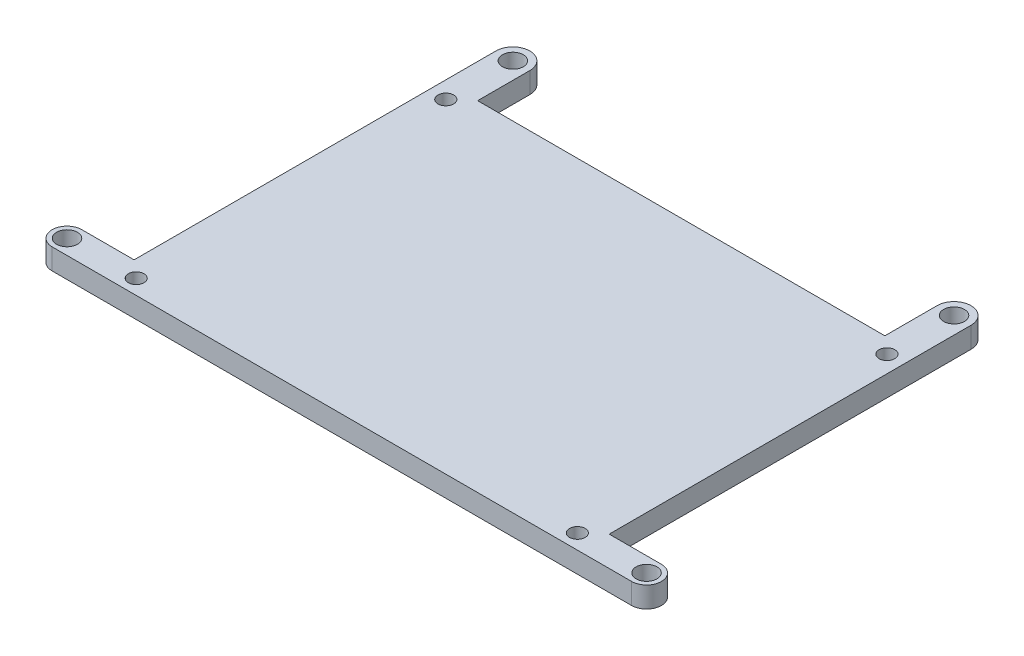
ISO-10303-21;
HEADER;
FILE_DESCRIPTION(('STEP AP214'),'2;1');
FILE_NAME('part.step','',(''),(''),'','','');
FILE_SCHEMA(('AUTOMOTIVE_DESIGN { 1 0 10303 214 1 1 1 1 }'));
ENDSEC;
DATA;
#1=APPLICATION_CONTEXT('core data for automotive mechanical design processes');
#2=APPLICATION_PROTOCOL_DEFINITION('international standard','automotive_design',2000,#1);
#3=PRODUCT_CONTEXT('',#1,'mechanical');
#4=PRODUCT('Part','Part','',(#3));
#5=PRODUCT_RELATED_PRODUCT_CATEGORY('part','',(#4));
#6=PRODUCT_DEFINITION_FORMATION('','',#4);
#7=PRODUCT_DEFINITION_CONTEXT('part definition',#1,'design');
#8=PRODUCT_DEFINITION('design','',#6,#7);
#9=PRODUCT_DEFINITION_SHAPE('','',#8);
#10=(LENGTH_UNIT() NAMED_UNIT(*) SI_UNIT(.MILLI.,.METRE.));
#11=(NAMED_UNIT(*) PLANE_ANGLE_UNIT() SI_UNIT($,.RADIAN.));
#12=(NAMED_UNIT(*) SI_UNIT($,.STERADIAN.) SOLID_ANGLE_UNIT());
#13=UNCERTAINTY_MEASURE_WITH_UNIT(LENGTH_MEASURE(1.E-05),#10,'distance_accuracy_value','');
#14=(GEOMETRIC_REPRESENTATION_CONTEXT(3) GLOBAL_UNCERTAINTY_ASSIGNED_CONTEXT((#13)) GLOBAL_UNIT_ASSIGNED_CONTEXT((#10,
#11,#12)) REPRESENTATION_CONTEXT('',''));
#15=CARTESIAN_POINT('',(0.,0.,0.));
#16=DIRECTION('',(0.,0.,1.));
#17=DIRECTION('',(1.,0.,0.));
#18=AXIS2_PLACEMENT_3D('',#15,#16,#17);
#19=CARTESIAN_POINT('',(0.,2.,32.5));
#20=DIRECTION('',(0.,0.,-1.));
#21=DIRECTION('',(-1.,0.,0.));
#22=AXIS2_PLACEMENT_3D('',#19,#20,#21);
#23=PLANE('',#22);
#24=DIRECTION('',(1.,0.,0.));
#25=VECTOR('',#24,1.);
#26=CARTESIAN_POINT('',(0.,-2.,32.5));
#27=LINE('',#26,#25);
#28=CARTESIAN_POINT('',(-55.5,-2.,32.5));
#29=VERTEX_POINT('',#28);
#30=CARTESIAN_POINT('',(55.5,-2.,32.5));
#31=VERTEX_POINT('',#30);
#32=EDGE_CURVE('E181',#29,#31,#27,.T.);
#33=ORIENTED_EDGE('',*,*,#32,.T.);
#34=DIRECTION('',(0.,-1.,0.));
#35=VECTOR('',#34,1.);
#36=CARTESIAN_POINT('',(55.5,2.,32.5));
#37=LINE('',#36,#35);
#38=CARTESIAN_POINT('',(55.5,2.,32.5));
#39=VERTEX_POINT('',#38);
#40=EDGE_CURVE('E11',#39,#31,#37,.T.);
#41=ORIENTED_EDGE('',*,*,#40,.F.);
#42=DIRECTION('',(1.,0.,0.));
#43=VECTOR('',#42,1.);
#44=CARTESIAN_POINT('',(0.,2.,32.5));
#45=LINE('',#44,#43);
#46=CARTESIAN_POINT('',(-55.5,2.,32.5));
#47=VERTEX_POINT('',#46);
#48=EDGE_CURVE('E538',#47,#39,#45,.T.);
#49=ORIENTED_EDGE('',*,*,#48,.F.);
#50=DIRECTION('',(0.,-1.,0.));
#51=VECTOR('',#50,1.);
#52=CARTESIAN_POINT('',(-55.5,2.,32.5));
#53=LINE('',#52,#51);
#54=EDGE_CURVE('E52',#47,#29,#53,.T.);
#55=ORIENTED_EDGE('',*,*,#54,.T.);
#56=EDGE_LOOP('',(#33,#41,#49,#55));
#57=FACE_BOUND('',#56,.T.);
#58=ADVANCED_FACE('F35',(#57),#23,.F.);
#59=CARTESIAN_POINT('',(55.5,2.,29.65));
#60=DIRECTION('',(0.,-1.,0.));
#61=DIRECTION('',(0.,0.,-1.));
#62=AXIS2_PLACEMENT_3D('',#59,#60,#61);
#63=CYLINDRICAL_SURFACE('',#62,2.84999999999999);
#64=CARTESIAN_POINT('',(55.5,-2.,29.65));
#65=DIRECTION('',(0.,1.,0.));
#66=DIRECTION('',(0.,0.,1.));
#67=AXIS2_PLACEMENT_3D('',#64,#65,#66);
#68=CIRCLE('',#67,2.84999999999999);
#69=CARTESIAN_POINT('',(55.5,-2.,26.8));
#70=VERTEX_POINT('',#69);
#71=EDGE_CURVE('E183',#31,#70,#68,.T.);
#72=ORIENTED_EDGE('',*,*,#71,.T.);
#73=DIRECTION('',(0.,-1.,0.));
#74=VECTOR('',#73,1.);
#75=CARTESIAN_POINT('',(55.5,2.,26.8));
#76=LINE('',#75,#74);
#77=CARTESIAN_POINT('',(55.5,2.,26.8));
#78=VERTEX_POINT('',#77);
#79=EDGE_CURVE('E44',#78,#70,#76,.T.);
#80=ORIENTED_EDGE('',*,*,#79,.F.);
#81=CARTESIAN_POINT('',(55.5,2.,29.65));
#82=DIRECTION('',(0.,1.,0.));
#83=DIRECTION('',(0.,0.,1.));
#84=AXIS2_PLACEMENT_3D('',#81,#82,#83);
#85=CIRCLE('',#84,2.84999999999999);
#86=EDGE_CURVE('E102',#39,#78,#85,.T.);
#87=ORIENTED_EDGE('',*,*,#86,.F.);
#88=ORIENTED_EDGE('',*,*,#40,.T.);
#89=EDGE_LOOP('',(#72,#80,#87,#88));
#90=FACE_BOUND('',#89,.T.);
#91=ADVANCED_FACE('F276',(#90),#63,.T.);
#92=CARTESIAN_POINT('',(1.48769885299773E-13,2.,26.8000000000003));
#93=DIRECTION('',(0.,0.,1.));
#94=DIRECTION('',(1.,0.,0.));
#95=AXIS2_PLACEMENT_3D('',#92,#93,#94);
#96=PLANE('',#95);
#97=DIRECTION('',(-1.,0.,0.));
#98=VECTOR('',#97,1.);
#99=CARTESIAN_POINT('',(1.48769885299773E-13,-2.,26.8000000000003));
#100=LINE('',#99,#98);
#101=CARTESIAN_POINT('',(45.5,-2.,26.8000000000001));
#102=VERTEX_POINT('',#101);
#103=EDGE_CURVE('E185',#70,#102,#100,.T.);
#104=ORIENTED_EDGE('',*,*,#103,.T.);
#105=DIRECTION('',(0.,-1.,0.));
#106=VECTOR('',#105,1.);
#107=CARTESIAN_POINT('',(45.5,2.,26.8000000000001));
#108=LINE('',#107,#106);
#109=CARTESIAN_POINT('',(45.5,2.,26.8000000000001));
#110=VERTEX_POINT('',#109);
#111=EDGE_CURVE('E226',#110,#102,#108,.T.);
#112=ORIENTED_EDGE('',*,*,#111,.F.);
#113=DIRECTION('',(-1.,0.,0.));
#114=VECTOR('',#113,1.);
#115=CARTESIAN_POINT('',(1.48769885299773E-13,2.,26.8000000000003));
#116=LINE('',#115,#114);
#117=EDGE_CURVE('E233',#78,#110,#116,.T.);
#118=ORIENTED_EDGE('',*,*,#117,.F.);
#119=ORIENTED_EDGE('',*,*,#79,.T.);
#120=EDGE_LOOP('',(#104,#112,#118,#119));
#121=FACE_BOUND('',#120,.T.);
#122=ADVANCED_FACE('F231',(#121),#96,.F.);
#123=CARTESIAN_POINT('',(45.5,2.,0.));
#124=DIRECTION('',(1.,0.,0.));
#125=DIRECTION('',(0.,0.,-1.));
#126=AXIS2_PLACEMENT_3D('',#123,#124,#125);
#127=PLANE('',#126);
#128=DIRECTION('',(0.,0.,1.));
#129=VECTOR('',#128,1.);
#130=CARTESIAN_POINT('',(45.5,-2.,0.));
#131=LINE('',#130,#129);
#132=CARTESIAN_POINT('',(45.5,-2.,-42.5));
#133=VERTEX_POINT('',#132);
#134=EDGE_CURVE('E188',#133,#102,#131,.T.);
#135=ORIENTED_EDGE('',*,*,#134,.F.);
#136=DIRECTION('',(0.,-1.,0.));
#137=VECTOR('',#136,1.);
#138=CARTESIAN_POINT('',(45.5,2.,-42.5));
#139=LINE('',#138,#137);
#140=CARTESIAN_POINT('',(45.5,2.,-42.5));
#141=VERTEX_POINT('',#140);
#142=EDGE_CURVE('E224',#141,#133,#139,.T.);
#143=ORIENTED_EDGE('',*,*,#142,.F.);
#144=DIRECTION('',(0.,0.,1.));
#145=VECTOR('',#144,1.);
#146=CARTESIAN_POINT('',(45.5,2.,0.));
#147=LINE('',#146,#145);
#148=EDGE_CURVE('E244',#141,#110,#147,.T.);
#149=ORIENTED_EDGE('',*,*,#148,.T.);
#150=ORIENTED_EDGE('',*,*,#111,.T.);
#151=EDGE_LOOP('',(#135,#143,#149,#150));
#152=FACE_BOUND('',#151,.T.);
#153=ADVANCED_FACE('F240',(#152),#127,.T.);
#154=CARTESIAN_POINT('',(42.25,2.,-42.5));
#155=DIRECTION('',(0.,-1.,0.));
#156=DIRECTION('',(0.,0.,-1.));
#157=AXIS2_PLACEMENT_3D('',#154,#155,#156);
#158=CYLINDRICAL_SURFACE('',#157,3.25);
#159=CARTESIAN_POINT('',(42.25,-2.,-42.5));
#160=DIRECTION('',(0.,1.,0.));
#161=DIRECTION('',(0.,0.,1.));
#162=AXIS2_PLACEMENT_3D('',#159,#160,#161);
#163=CIRCLE('',#162,3.25);
#164=CARTESIAN_POINT('',(39.,-2.,-42.5));
#165=VERTEX_POINT('',#164);
#166=EDGE_CURVE('E191',#133,#165,#163,.T.);
#167=ORIENTED_EDGE('',*,*,#166,.T.);
#168=DIRECTION('',(0.,-1.,0.));
#169=VECTOR('',#168,1.);
#170=CARTESIAN_POINT('',(39.,2.,-42.5));
#171=LINE('',#170,#169);
#172=CARTESIAN_POINT('',(39.,2.,-42.5));
#173=VERTEX_POINT('',#172);
#174=EDGE_CURVE('E221',#173,#165,#171,.T.);
#175=ORIENTED_EDGE('',*,*,#174,.F.);
#176=CARTESIAN_POINT('',(42.25,2.,-42.5));
#177=DIRECTION('',(0.,1.,0.));
#178=DIRECTION('',(0.,0.,1.));
#179=AXIS2_PLACEMENT_3D('',#176,#177,#178);
#180=CIRCLE('',#179,3.25);
#181=EDGE_CURVE('E245',#141,#173,#180,.T.);
#182=ORIENTED_EDGE('',*,*,#181,.F.);
#183=ORIENTED_EDGE('',*,*,#142,.T.);
#184=EDGE_LOOP('',(#167,#175,#182,#183));
#185=FACE_BOUND('',#184,.T.);
#186=ADVANCED_FACE('F451',(#185),#158,.T.);
#187=CARTESIAN_POINT('',(39.,2.,0.));
#188=DIRECTION('',(1.,0.,0.));
#189=DIRECTION('',(0.,0.,-1.));
#190=AXIS2_PLACEMENT_3D('',#187,#188,#189);
#191=PLANE('',#190);
#192=DIRECTION('',(0.,0.,1.));
#193=VECTOR('',#192,1.);
#194=CARTESIAN_POINT('',(39.,-2.,0.));
#195=LINE('',#194,#193);
#196=CARTESIAN_POINT('',(39.,-2.,-32.5));
#197=VERTEX_POINT('',#196);
#198=EDGE_CURVE('E193',#165,#197,#195,.T.);
#199=ORIENTED_EDGE('',*,*,#198,.T.);
#200=DIRECTION('',(0.,-1.,0.));
#201=VECTOR('',#200,1.);
#202=CARTESIAN_POINT('',(39.,2.,-32.5));
#203=LINE('',#202,#201);
#204=CARTESIAN_POINT('',(39.,2.,-32.5));
#205=VERTEX_POINT('',#204);
#206=EDGE_CURVE('E219',#205,#197,#203,.T.);
#207=ORIENTED_EDGE('',*,*,#206,.F.);
#208=DIRECTION('',(0.,0.,1.));
#209=VECTOR('',#208,1.);
#210=CARTESIAN_POINT('',(39.,2.,0.));
#211=LINE('',#210,#209);
#212=EDGE_CURVE('E247',#173,#205,#211,.T.);
#213=ORIENTED_EDGE('',*,*,#212,.F.);
#214=ORIENTED_EDGE('',*,*,#174,.T.);
#215=EDGE_LOOP('',(#199,#207,#213,#214));
#216=FACE_BOUND('',#215,.T.);
#217=ADVANCED_FACE('F441',(#216),#191,.F.);
#218=CARTESIAN_POINT('',(0.,2.,-32.5));
#219=DIRECTION('',(0.,0.,-1.));
#220=DIRECTION('',(-1.,0.,0.));
#221=AXIS2_PLACEMENT_3D('',#218,#219,#220);
#222=PLANE('',#221);
#223=DIRECTION('',(1.,0.,0.));
#224=VECTOR('',#223,1.);
#225=CARTESIAN_POINT('',(0.,-2.,-32.5));
#226=LINE('',#225,#224);
#227=CARTESIAN_POINT('',(-39.,-2.,-32.5));
#228=VERTEX_POINT('',#227);
#229=EDGE_CURVE('E196',#228,#197,#226,.T.);
#230=ORIENTED_EDGE('',*,*,#229,.F.);
#231=DIRECTION('',(0.,-1.,0.));
#232=VECTOR('',#231,1.);
#233=CARTESIAN_POINT('',(-39.,2.,-32.5));
#234=LINE('',#233,#232);
#235=CARTESIAN_POINT('',(-39.,2.,-32.5));
#236=VERTEX_POINT('',#235);
#237=EDGE_CURVE('E217',#236,#228,#234,.T.);
#238=ORIENTED_EDGE('',*,*,#237,.F.);
#239=DIRECTION('',(1.,0.,0.));
#240=VECTOR('',#239,1.);
#241=CARTESIAN_POINT('',(0.,2.,-32.5));
#242=LINE('',#241,#240);
#243=EDGE_CURVE('E253',#236,#205,#242,.T.);
#244=ORIENTED_EDGE('',*,*,#243,.T.);
#245=ORIENTED_EDGE('',*,*,#206,.T.);
#246=EDGE_LOOP('',(#230,#238,#244,#245));
#247=FACE_BOUND('',#246,.T.);
#248=ADVANCED_FACE('F431',(#247),#222,.T.);
#249=CARTESIAN_POINT('',(-39.,2.,0.));
#250=DIRECTION('',(1.,0.,0.));
#251=DIRECTION('',(0.,0.,-1.));
#252=AXIS2_PLACEMENT_3D('',#249,#250,#251);
#253=PLANE('',#252);
#254=DIRECTION('',(0.,0.,1.));
#255=VECTOR('',#254,1.);
#256=CARTESIAN_POINT('',(-39.,-2.,0.));
#257=LINE('',#256,#255);
#258=CARTESIAN_POINT('',(-39.,-2.,-42.5));
#259=VERTEX_POINT('',#258);
#260=EDGE_CURVE('E199',#259,#228,#257,.T.);
#261=ORIENTED_EDGE('',*,*,#260,.F.);
#262=DIRECTION('',(0.,-1.,0.));
#263=VECTOR('',#262,1.);
#264=CARTESIAN_POINT('',(-39.,2.,-42.5));
#265=LINE('',#264,#263);
#266=CARTESIAN_POINT('',(-39.,2.,-42.5));
#267=VERTEX_POINT('',#266);
#268=EDGE_CURVE('E215',#267,#259,#265,.T.);
#269=ORIENTED_EDGE('',*,*,#268,.F.);
#270=DIRECTION('',(0.,0.,1.));
#271=VECTOR('',#270,1.);
#272=CARTESIAN_POINT('',(-39.,2.,0.));
#273=LINE('',#272,#271);
#274=EDGE_CURVE('E256',#267,#236,#273,.T.);
#275=ORIENTED_EDGE('',*,*,#274,.T.);
#276=ORIENTED_EDGE('',*,*,#237,.T.);
#277=EDGE_LOOP('',(#261,#269,#275,#276));
#278=FACE_BOUND('',#277,.T.);
#279=ADVANCED_FACE('F422',(#278),#253,.T.);
#280=CARTESIAN_POINT('',(-42.25,2.,-42.5));
#281=DIRECTION('',(0.,-1.,0.));
#282=DIRECTION('',(0.,0.,-1.));
#283=AXIS2_PLACEMENT_3D('',#280,#281,#282);
#284=CYLINDRICAL_SURFACE('',#283,3.25);
#285=CARTESIAN_POINT('',(-42.25,-2.,-42.5));
#286=DIRECTION('',(0.,1.,0.));
#287=DIRECTION('',(0.,0.,1.));
#288=AXIS2_PLACEMENT_3D('',#285,#286,#287);
#289=CIRCLE('',#288,3.25);
#290=CARTESIAN_POINT('',(-45.5,-2.,-42.5));
#291=VERTEX_POINT('',#290);
#292=EDGE_CURVE('E202',#291,#259,#289,.F.);
#293=ORIENTED_EDGE('',*,*,#292,.F.);
#294=DIRECTION('',(0.,-1.,0.));
#295=VECTOR('',#294,1.);
#296=CARTESIAN_POINT('',(-45.5,2.,-42.5));
#297=LINE('',#296,#295);
#298=CARTESIAN_POINT('',(-45.5,2.,-42.5));
#299=VERTEX_POINT('',#298);
#300=EDGE_CURVE('E139',#299,#291,#297,.T.);
#301=ORIENTED_EDGE('',*,*,#300,.F.);
#302=CARTESIAN_POINT('',(-42.25,2.,-42.5));
#303=DIRECTION('',(0.,1.,0.));
#304=DIRECTION('',(0.,0.,1.));
#305=AXIS2_PLACEMENT_3D('',#302,#303,#304);
#306=CIRCLE('',#305,3.25);
#307=EDGE_CURVE('E149',#299,#267,#306,.F.);
#308=ORIENTED_EDGE('',*,*,#307,.T.);
#309=ORIENTED_EDGE('',*,*,#268,.T.);
#310=EDGE_LOOP('',(#293,#301,#308,#309));
#311=FACE_BOUND('',#310,.T.);
#312=ADVANCED_FACE('F260',(#311),#284,.T.);
#313=CARTESIAN_POINT('',(-45.5,2.,0.));
#314=DIRECTION('',(-1.,0.,0.));
#315=DIRECTION('',(0.,0.,1.));
#316=AXIS2_PLACEMENT_3D('',#313,#314,#315);
#317=PLANE('',#316);
#318=DIRECTION('',(0.,0.,-1.));
#319=VECTOR('',#318,1.);
#320=CARTESIAN_POINT('',(-45.5,-2.,0.));
#321=LINE('',#320,#319);
#322=CARTESIAN_POINT('',(-45.5,-2.,26.8000000000001));
#323=VERTEX_POINT('',#322);
#324=EDGE_CURVE('E135',#323,#291,#321,.T.);
#325=ORIENTED_EDGE('',*,*,#324,.F.);
#326=DIRECTION('',(0.,-1.,0.));
#327=VECTOR('',#326,1.);
#328=CARTESIAN_POINT('',(-45.5,2.,26.8000000000001));
#329=LINE('',#328,#327);
#330=CARTESIAN_POINT('',(-45.5,2.,26.8000000000001));
#331=VERTEX_POINT('',#330);
#332=EDGE_CURVE('E130',#331,#323,#329,.T.);
#333=ORIENTED_EDGE('',*,*,#332,.F.);
#334=DIRECTION('',(0.,0.,-1.));
#335=VECTOR('',#334,1.);
#336=CARTESIAN_POINT('',(-45.5,2.,0.));
#337=LINE('',#336,#335);
#338=EDGE_CURVE('E133',#331,#299,#337,.T.);
#339=ORIENTED_EDGE('',*,*,#338,.T.);
#340=ORIENTED_EDGE('',*,*,#300,.T.);
#341=EDGE_LOOP('',(#325,#333,#339,#340));
#342=FACE_BOUND('',#341,.T.);
#343=ADVANCED_FACE('F132',(#342),#317,.T.);
#344=CARTESIAN_POINT('',(-1.48769885299773E-13,2.,26.8000000000003));
#345=DIRECTION('',(0.,0.,-1.));
#346=DIRECTION('',(-1.,0.,0.));
#347=AXIS2_PLACEMENT_3D('',#344,#345,#346);
#348=PLANE('',#347);
#349=DIRECTION('',(1.,0.,0.));
#350=VECTOR('',#349,1.);
#351=CARTESIAN_POINT('',(-1.48769885299773E-13,-2.,26.8000000000003));
#352=LINE('',#351,#350);
#353=CARTESIAN_POINT('',(-55.5,-2.,26.8));
#354=VERTEX_POINT('',#353);
#355=EDGE_CURVE('E206',#354,#323,#352,.T.);
#356=ORIENTED_EDGE('',*,*,#355,.F.);
#357=DIRECTION('',(0.,-1.,0.));
#358=VECTOR('',#357,1.);
#359=CARTESIAN_POINT('',(-55.5,2.,26.8));
#360=LINE('',#359,#358);
#361=CARTESIAN_POINT('',(-55.5,2.,26.8));
#362=VERTEX_POINT('',#361);
#363=EDGE_CURVE('E90',#362,#354,#360,.T.);
#364=ORIENTED_EDGE('',*,*,#363,.F.);
#365=DIRECTION('',(1.,0.,0.));
#366=VECTOR('',#365,1.);
#367=CARTESIAN_POINT('',(-1.48769885299773E-13,2.,26.8000000000003));
#368=LINE('',#367,#366);
#369=EDGE_CURVE('E146',#362,#331,#368,.T.);
#370=ORIENTED_EDGE('',*,*,#369,.T.);
#371=ORIENTED_EDGE('',*,*,#332,.T.);
#372=EDGE_LOOP('',(#356,#364,#370,#371));
#373=FACE_BOUND('',#372,.T.);
#374=ADVANCED_FACE('F151',(#373),#348,.T.);
#375=CARTESIAN_POINT('',(42.25,2.,-42.5));
#376=DIRECTION('',(0.,-1.,0.));
#377=DIRECTION('',(0.,0.,-1.));
#378=AXIS2_PLACEMENT_3D('',#375,#376,#377);
#379=CYLINDRICAL_SURFACE('',#378,2.);
#380=CARTESIAN_POINT('',(42.25,2.,-42.5));
#381=DIRECTION('',(0.,1.,0.));
#382=DIRECTION('',(0.,0.,1.));
#383=AXIS2_PLACEMENT_3D('',#380,#381,#382);
#384=CIRCLE('',#383,2.);
#385=CARTESIAN_POINT('',(42.25,2.,-40.5));
#386=VERTEX_POINT('',#385);
#387=EDGE_CURVE('E535',#386,#386,#384,.F.);
#388=ORIENTED_EDGE('',*,*,#387,.F.);
#389=EDGE_LOOP('',(#388));
#390=FACE_BOUND('',#389,.T.);
#391=CARTESIAN_POINT('',(42.25,-2.,-42.5));
#392=DIRECTION('',(0.,1.,0.));
#393=DIRECTION('',(0.,0.,1.));
#394=AXIS2_PLACEMENT_3D('',#391,#392,#393);
#395=CIRCLE('',#394,2.);
#396=CARTESIAN_POINT('',(42.25,-2.,-40.5));
#397=VERTEX_POINT('',#396);
#398=EDGE_CURVE('E178',#397,#397,#395,.F.);
#399=ORIENTED_EDGE('',*,*,#398,.T.);
#400=EDGE_LOOP('',(#399));
#401=FACE_BOUND('',#400,.T.);
#402=ADVANCED_FACE('F284',(#390,#401),#379,.F.);
#403=CARTESIAN_POINT('',(-42.25,2.,-42.5));
#404=DIRECTION('',(0.,-1.,0.));
#405=DIRECTION('',(0.,0.,-1.));
#406=AXIS2_PLACEMENT_3D('',#403,#404,#405);
#407=CYLINDRICAL_SURFACE('',#406,2.);
#408=CARTESIAN_POINT('',(-42.25,2.,-42.5));
#409=DIRECTION('',(0.,1.,0.));
#410=DIRECTION('',(0.,0.,1.));
#411=AXIS2_PLACEMENT_3D('',#408,#409,#410);
#412=CIRCLE('',#411,2.);
#413=CARTESIAN_POINT('',(-42.25,2.,-40.5));
#414=VERTEX_POINT('',#413);
#415=EDGE_CURVE('E532',#414,#414,#412,.T.);
#416=ORIENTED_EDGE('',*,*,#415,.T.);
#417=EDGE_LOOP('',(#416));
#418=FACE_BOUND('',#417,.T.);
#419=CARTESIAN_POINT('',(-42.25,-2.,-42.5));
#420=DIRECTION('',(0.,1.,0.));
#421=DIRECTION('',(0.,0.,1.));
#422=AXIS2_PLACEMENT_3D('',#419,#420,#421);
#423=CIRCLE('',#422,2.);
#424=CARTESIAN_POINT('',(-42.25,-2.,-40.5));
#425=VERTEX_POINT('',#424);
#426=EDGE_CURVE('E175',#425,#425,#423,.T.);
#427=ORIENTED_EDGE('',*,*,#426,.F.);
#428=EDGE_LOOP('',(#427));
#429=FACE_BOUND('',#428,.T.);
#430=ADVANCED_FACE('F287',(#418,#429),#407,.F.);
#431=CARTESIAN_POINT('',(42.25,2.,-29.65));
#432=DIRECTION('',(0.,-1.,0.));
#433=DIRECTION('',(0.,0.,-1.));
#434=AXIS2_PLACEMENT_3D('',#431,#432,#433);
#435=CYLINDRICAL_SURFACE('',#434,1.5);
#436=CARTESIAN_POINT('',(42.25,2.,-29.65));
#437=DIRECTION('',(0.,1.,0.));
#438=DIRECTION('',(0.,0.,1.));
#439=AXIS2_PLACEMENT_3D('',#436,#437,#438);
#440=CIRCLE('',#439,1.5);
#441=CARTESIAN_POINT('',(42.25,2.,-28.15));
#442=VERTEX_POINT('',#441);
#443=EDGE_CURVE('E529',#442,#442,#440,.F.);
#444=ORIENTED_EDGE('',*,*,#443,.F.);
#445=EDGE_LOOP('',(#444));
#446=FACE_BOUND('',#445,.T.);
#447=CARTESIAN_POINT('',(42.25,-2.,-29.65));
#448=DIRECTION('',(0.,1.,0.));
#449=DIRECTION('',(0.,0.,1.));
#450=AXIS2_PLACEMENT_3D('',#447,#448,#449);
#451=CIRCLE('',#450,1.5);
#452=CARTESIAN_POINT('',(42.25,-2.,-28.15));
#453=VERTEX_POINT('',#452);
#454=EDGE_CURVE('E172',#453,#453,#451,.F.);
#455=ORIENTED_EDGE('',*,*,#454,.T.);
#456=EDGE_LOOP('',(#455));
#457=FACE_BOUND('',#456,.T.);
#458=ADVANCED_FACE('F291',(#446,#457),#435,.F.);
#459=CARTESIAN_POINT('',(-42.25,2.,-29.65));
#460=DIRECTION('',(0.,-1.,0.));
#461=DIRECTION('',(0.,0.,-1.));
#462=AXIS2_PLACEMENT_3D('',#459,#460,#461);
#463=CYLINDRICAL_SURFACE('',#462,1.5);
#464=CARTESIAN_POINT('',(-42.25,2.,-29.65));
#465=DIRECTION('',(0.,1.,0.));
#466=DIRECTION('',(0.,0.,1.));
#467=AXIS2_PLACEMENT_3D('',#464,#465,#466);
#468=CIRCLE('',#467,1.5);
#469=CARTESIAN_POINT('',(-42.25,2.,-28.15));
#470=VERTEX_POINT('',#469);
#471=EDGE_CURVE('E526',#470,#470,#468,.T.);
#472=ORIENTED_EDGE('',*,*,#471,.T.);
#473=EDGE_LOOP('',(#472));
#474=FACE_BOUND('',#473,.T.);
#475=CARTESIAN_POINT('',(-42.25,-2.,-29.65));
#476=DIRECTION('',(0.,1.,0.));
#477=DIRECTION('',(0.,0.,1.));
#478=AXIS2_PLACEMENT_3D('',#475,#476,#477);
#479=CIRCLE('',#478,1.5);
#480=CARTESIAN_POINT('',(-42.25,-2.,-28.15));
#481=VERTEX_POINT('',#480);
#482=EDGE_CURVE('E169',#481,#481,#479,.T.);
#483=ORIENTED_EDGE('',*,*,#482,.F.);
#484=EDGE_LOOP('',(#483));
#485=FACE_BOUND('',#484,.T.);
#486=ADVANCED_FACE('F295',(#474,#485),#463,.F.);
#487=CARTESIAN_POINT('',(42.25,2.,29.65));
#488=DIRECTION('',(0.,-1.,0.));
#489=DIRECTION('',(0.,0.,-1.));
#490=AXIS2_PLACEMENT_3D('',#487,#488,#489);
#491=CYLINDRICAL_SURFACE('',#490,1.5);
#492=CARTESIAN_POINT('',(42.25,2.,29.65));
#493=DIRECTION('',(0.,1.,0.));
#494=DIRECTION('',(0.,0.,1.));
#495=AXIS2_PLACEMENT_3D('',#492,#493,#494);
#496=CIRCLE('',#495,1.5);
#497=CARTESIAN_POINT('',(42.25,2.,31.15));
#498=VERTEX_POINT('',#497);
#499=EDGE_CURVE('E519',#498,#498,#496,.T.);
#500=ORIENTED_EDGE('',*,*,#499,.T.);
#501=EDGE_LOOP('',(#500));
#502=FACE_BOUND('',#501,.T.);
#503=CARTESIAN_POINT('',(42.25,-2.,29.65));
#504=DIRECTION('',(0.,1.,0.));
#505=DIRECTION('',(0.,0.,1.));
#506=AXIS2_PLACEMENT_3D('',#503,#504,#505);
#507=CIRCLE('',#506,1.5);
#508=CARTESIAN_POINT('',(42.25,-2.,31.15));
#509=VERTEX_POINT('',#508);
#510=EDGE_CURVE('E166',#509,#509,#507,.T.);
#511=ORIENTED_EDGE('',*,*,#510,.F.);
#512=EDGE_LOOP('',(#511));
#513=FACE_BOUND('',#512,.T.);
#514=ADVANCED_FACE('F299',(#502,#513),#491,.F.);
#515=CARTESIAN_POINT('',(-42.25,2.,29.65));
#516=DIRECTION('',(0.,-1.,0.));
#517=DIRECTION('',(0.,0.,-1.));
#518=AXIS2_PLACEMENT_3D('',#515,#516,#517);
#519=CYLINDRICAL_SURFACE('',#518,1.5);
#520=CARTESIAN_POINT('',(-42.25,2.,29.65));
#521=DIRECTION('',(0.,1.,0.));
#522=DIRECTION('',(0.,0.,1.));
#523=AXIS2_PLACEMENT_3D('',#520,#521,#522);
#524=CIRCLE('',#523,1.5);
#525=CARTESIAN_POINT('',(-42.25,2.,31.15));
#526=VERTEX_POINT('',#525);
#527=EDGE_CURVE('E516',#526,#526,#524,.F.);
#528=ORIENTED_EDGE('',*,*,#527,.F.);
#529=EDGE_LOOP('',(#528));
#530=FACE_BOUND('',#529,.T.);
#531=CARTESIAN_POINT('',(-42.25,-2.,29.65));
#532=DIRECTION('',(0.,1.,0.));
#533=DIRECTION('',(0.,0.,1.));
#534=AXIS2_PLACEMENT_3D('',#531,#532,#533);
#535=CIRCLE('',#534,1.5);
#536=CARTESIAN_POINT('',(-42.25,-2.,31.15));
#537=VERTEX_POINT('',#536);
#538=EDGE_CURVE('E163',#537,#537,#535,.F.);
#539=ORIENTED_EDGE('',*,*,#538,.T.);
#540=EDGE_LOOP('',(#539));
#541=FACE_BOUND('',#540,.T.);
#542=ADVANCED_FACE('F303',(#530,#541),#519,.F.);
#543=CARTESIAN_POINT('',(-55.5,2.,29.65));
#544=DIRECTION('',(0.,-1.,0.));
#545=DIRECTION('',(0.,0.,-1.));
#546=AXIS2_PLACEMENT_3D('',#543,#544,#545);
#547=CYLINDRICAL_SURFACE('',#546,2.);
#548=CARTESIAN_POINT('',(-55.5,2.,29.65));
#549=DIRECTION('',(0.,1.,0.));
#550=DIRECTION('',(0.,0.,1.));
#551=AXIS2_PLACEMENT_3D('',#548,#549,#550);
#552=CIRCLE('',#551,2.);
#553=CARTESIAN_POINT('',(-55.5,2.,31.65));
#554=VERTEX_POINT('',#553);
#555=EDGE_CURVE('E314',#554,#554,#552,.T.);
#556=ORIENTED_EDGE('',*,*,#555,.T.);
#557=EDGE_LOOP('',(#556));
#558=FACE_BOUND('',#557,.T.);
#559=CARTESIAN_POINT('',(-55.5,-2.,29.65));
#560=DIRECTION('',(0.,1.,0.));
#561=DIRECTION('',(0.,0.,1.));
#562=AXIS2_PLACEMENT_3D('',#559,#560,#561);
#563=CIRCLE('',#562,2.);
#564=CARTESIAN_POINT('',(-55.5,-2.,31.65));
#565=VERTEX_POINT('',#564);
#566=EDGE_CURVE('E160',#565,#565,#563,.T.);
#567=ORIENTED_EDGE('',*,*,#566,.F.);
#568=EDGE_LOOP('',(#567));
#569=FACE_BOUND('',#568,.T.);
#570=ADVANCED_FACE('F271',(#558,#569),#547,.F.);
#571=CARTESIAN_POINT('',(55.5,2.,29.65));
#572=DIRECTION('',(0.,-1.,0.));
#573=DIRECTION('',(0.,0.,-1.));
#574=AXIS2_PLACEMENT_3D('',#571,#572,#573);
#575=CYLINDRICAL_SURFACE('',#574,2.);
#576=CARTESIAN_POINT('',(55.5,2.,29.65));
#577=DIRECTION('',(0.,1.,0.));
#578=DIRECTION('',(0.,0.,1.));
#579=AXIS2_PLACEMENT_3D('',#576,#577,#578);
#580=CIRCLE('',#579,2.);
#581=CARTESIAN_POINT('',(55.5,2.,31.65));
#582=VERTEX_POINT('',#581);
#583=EDGE_CURVE('E211',#582,#582,#580,.F.);
#584=ORIENTED_EDGE('',*,*,#583,.F.);
#585=EDGE_LOOP('',(#584));
#586=FACE_BOUND('',#585,.T.);
#587=CARTESIAN_POINT('',(55.5,-2.,29.65));
#588=DIRECTION('',(0.,1.,0.));
#589=DIRECTION('',(0.,0.,1.));
#590=AXIS2_PLACEMENT_3D('',#587,#588,#589);
#591=CIRCLE('',#590,2.);
#592=CARTESIAN_POINT('',(55.5,-2.,31.65));
#593=VERTEX_POINT('',#592);
#594=EDGE_CURVE('E157',#593,#593,#591,.F.);
#595=ORIENTED_EDGE('',*,*,#594,.T.);
#596=EDGE_LOOP('',(#595));
#597=FACE_BOUND('',#596,.T.);
#598=ADVANCED_FACE('F37',(#586,#597),#575,.F.);
#599=CARTESIAN_POINT('',(-55.5,2.,29.65));
#600=DIRECTION('',(0.,-1.,0.));
#601=DIRECTION('',(0.,0.,-1.));
#602=AXIS2_PLACEMENT_3D('',#599,#600,#601);
#603=CYLINDRICAL_SURFACE('',#602,2.84999999999999);
#604=CARTESIAN_POINT('',(-55.5,-2.,29.65));
#605=DIRECTION('',(0.,1.,0.));
#606=DIRECTION('',(0.,0.,1.));
#607=AXIS2_PLACEMENT_3D('',#604,#605,#606);
#608=CIRCLE('',#607,2.84999999999999);
#609=EDGE_CURVE('E208',#29,#354,#608,.F.);
#610=ORIENTED_EDGE('',*,*,#609,.F.);
#611=ORIENTED_EDGE('',*,*,#54,.F.);
#612=CARTESIAN_POINT('',(-55.5,2.,29.65));
#613=DIRECTION('',(0.,1.,0.));
#614=DIRECTION('',(0.,0.,1.));
#615=AXIS2_PLACEMENT_3D('',#612,#613,#614);
#616=CIRCLE('',#615,2.84999999999999);
#617=EDGE_CURVE('E152',#47,#362,#616,.F.);
#618=ORIENTED_EDGE('',*,*,#617,.T.);
#619=ORIENTED_EDGE('',*,*,#363,.T.);
#620=EDGE_LOOP('',(#610,#611,#618,#619));
#621=FACE_BOUND('',#620,.T.);
#622=ADVANCED_FACE('F262',(#621),#603,.T.);
#623=CARTESIAN_POINT('',(0.,2.,0.));
#624=DIRECTION('',(0.,1.,0.));
#625=DIRECTION('',(0.,0.,1.));
#626=AXIS2_PLACEMENT_3D('',#623,#624,#625);
#627=PLANE('',#626);
#628=ORIENTED_EDGE('',*,*,#583,.T.);
#629=EDGE_LOOP('',(#628));
#630=FACE_BOUND('',#629,.T.);
#631=ORIENTED_EDGE('',*,*,#555,.F.);
#632=EDGE_LOOP('',(#631));
#633=FACE_BOUND('',#632,.T.);
#634=ORIENTED_EDGE('',*,*,#527,.T.);
#635=EDGE_LOOP('',(#634));
#636=FACE_BOUND('',#635,.T.);
#637=ORIENTED_EDGE('',*,*,#499,.F.);
#638=EDGE_LOOP('',(#637));
#639=FACE_BOUND('',#638,.T.);
#640=ORIENTED_EDGE('',*,*,#471,.F.);
#641=EDGE_LOOP('',(#640));
#642=FACE_BOUND('',#641,.T.);
#643=ORIENTED_EDGE('',*,*,#443,.T.);
#644=EDGE_LOOP('',(#643));
#645=FACE_BOUND('',#644,.T.);
#646=ORIENTED_EDGE('',*,*,#415,.F.);
#647=EDGE_LOOP('',(#646));
#648=FACE_BOUND('',#647,.T.);
#649=ORIENTED_EDGE('',*,*,#387,.T.);
#650=EDGE_LOOP('',(#649));
#651=FACE_BOUND('',#650,.T.);
#652=ORIENTED_EDGE('',*,*,#48,.T.);
#653=ORIENTED_EDGE('',*,*,#86,.T.);
#654=ORIENTED_EDGE('',*,*,#117,.T.);
#655=ORIENTED_EDGE('',*,*,#148,.F.);
#656=ORIENTED_EDGE('',*,*,#181,.T.);
#657=ORIENTED_EDGE('',*,*,#212,.T.);
#658=ORIENTED_EDGE('',*,*,#243,.F.);
#659=ORIENTED_EDGE('',*,*,#274,.F.);
#660=ORIENTED_EDGE('',*,*,#307,.F.);
#661=ORIENTED_EDGE('',*,*,#338,.F.);
#662=ORIENTED_EDGE('',*,*,#369,.F.);
#663=ORIENTED_EDGE('',*,*,#617,.F.);
#664=EDGE_LOOP('',(#652,#653,#654,#655,#656,#657,#658,#659,#660,#661,#662,#663));
#665=FACE_BOUND('',#664,.T.);
#666=ADVANCED_FACE('F144',(#630,#633,#636,#639,#642,#645,#648,#651,#665),#627,.T.);
#667=CARTESIAN_POINT('',(0.,-2.,0.));
#668=DIRECTION('',(0.,1.,0.));
#669=DIRECTION('',(0.,0.,1.));
#670=AXIS2_PLACEMENT_3D('',#667,#668,#669);
#671=PLANE('',#670);
#672=ORIENTED_EDGE('',*,*,#594,.F.);
#673=EDGE_LOOP('',(#672));
#674=FACE_BOUND('',#673,.T.);
#675=ORIENTED_EDGE('',*,*,#566,.T.);
#676=EDGE_LOOP('',(#675));
#677=FACE_BOUND('',#676,.T.);
#678=ORIENTED_EDGE('',*,*,#538,.F.);
#679=EDGE_LOOP('',(#678));
#680=FACE_BOUND('',#679,.T.);
#681=ORIENTED_EDGE('',*,*,#510,.T.);
#682=EDGE_LOOP('',(#681));
#683=FACE_BOUND('',#682,.T.);
#684=ORIENTED_EDGE('',*,*,#482,.T.);
#685=EDGE_LOOP('',(#684));
#686=FACE_BOUND('',#685,.T.);
#687=ORIENTED_EDGE('',*,*,#454,.F.);
#688=EDGE_LOOP('',(#687));
#689=FACE_BOUND('',#688,.T.);
#690=ORIENTED_EDGE('',*,*,#426,.T.);
#691=EDGE_LOOP('',(#690));
#692=FACE_BOUND('',#691,.T.);
#693=ORIENTED_EDGE('',*,*,#398,.F.);
#694=EDGE_LOOP('',(#693));
#695=FACE_BOUND('',#694,.T.);
#696=ORIENTED_EDGE('',*,*,#32,.F.);
#697=ORIENTED_EDGE('',*,*,#609,.T.);
#698=ORIENTED_EDGE('',*,*,#355,.T.);
#699=ORIENTED_EDGE('',*,*,#324,.T.);
#700=ORIENTED_EDGE('',*,*,#292,.T.);
#701=ORIENTED_EDGE('',*,*,#260,.T.);
#702=ORIENTED_EDGE('',*,*,#229,.T.);
#703=ORIENTED_EDGE('',*,*,#198,.F.);
#704=ORIENTED_EDGE('',*,*,#166,.F.);
#705=ORIENTED_EDGE('',*,*,#134,.T.);
#706=ORIENTED_EDGE('',*,*,#103,.F.);
#707=ORIENTED_EDGE('',*,*,#71,.F.);
#708=EDGE_LOOP('',(#696,#697,#698,#699,#700,#701,#702,#703,#704,#705,#706,#707));
#709=FACE_BOUND('',#708,.T.);
#710=ADVANCED_FACE('F235',(#674,#677,#680,#683,#686,#689,#692,#695,#709),#671,.F.);
#711=CLOSED_SHELL('',(#58,#91,#122,#153,#186,#217,#248,#279,#312,#343,#374,#402,#430,#458,#486,
#514,#542,#570,#598,#622,#666,#710));
#712=MANIFOLD_SOLID_BREP('B2',#711);
#713=ADVANCED_BREP_SHAPE_REPRESENTATION('',(#18,#712),#14);
#714=SHAPE_DEFINITION_REPRESENTATION(#9,#713);
ENDSEC;
END-ISO-10303-21;
